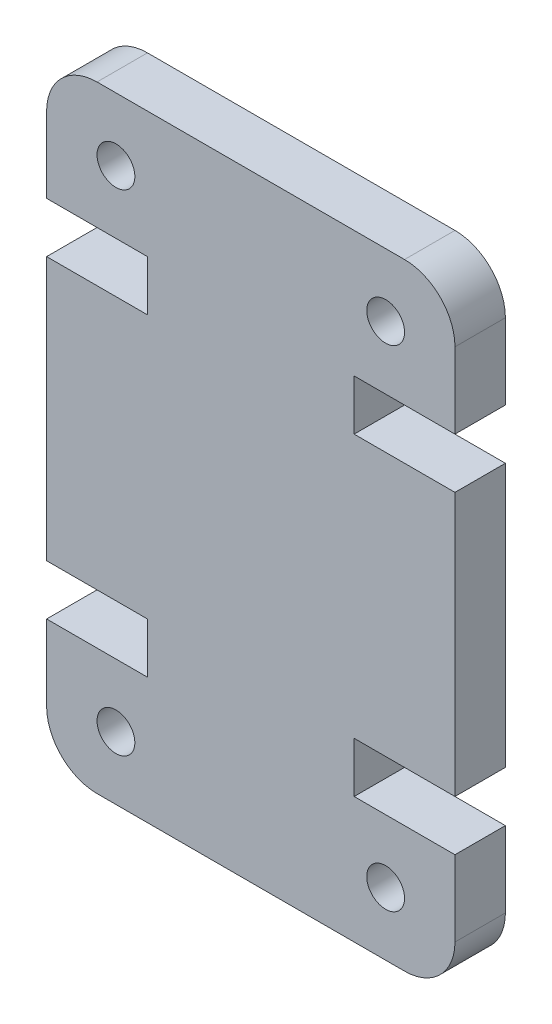
ISO-10303-21;
HEADER;
FILE_DESCRIPTION(('STEP AP214'),'2;1');
FILE_NAME('part.step','',(''),(''),'','','');
FILE_SCHEMA(('AUTOMOTIVE_DESIGN { 1 0 10303 214 1 1 1 1 }'));
ENDSEC;
DATA;
#1=APPLICATION_CONTEXT('core data for automotive mechanical design processes');
#2=APPLICATION_PROTOCOL_DEFINITION('international standard','automotive_design',2000,#1);
#3=PRODUCT_CONTEXT('',#1,'mechanical');
#4=PRODUCT('Part','Part','',(#3));
#5=PRODUCT_RELATED_PRODUCT_CATEGORY('part','',(#4));
#6=PRODUCT_DEFINITION_FORMATION('','',#4);
#7=PRODUCT_DEFINITION_CONTEXT('part definition',#1,'design');
#8=PRODUCT_DEFINITION('design','',#6,#7);
#9=PRODUCT_DEFINITION_SHAPE('','',#8);
#10=(LENGTH_UNIT() NAMED_UNIT(*) SI_UNIT(.MILLI.,.METRE.));
#11=(NAMED_UNIT(*) PLANE_ANGLE_UNIT() SI_UNIT($,.RADIAN.));
#12=(NAMED_UNIT(*) SI_UNIT($,.STERADIAN.) SOLID_ANGLE_UNIT());
#13=UNCERTAINTY_MEASURE_WITH_UNIT(LENGTH_MEASURE(1.E-05),#10,'distance_accuracy_value','');
#14=(GEOMETRIC_REPRESENTATION_CONTEXT(3) GLOBAL_UNCERTAINTY_ASSIGNED_CONTEXT((#13)) GLOBAL_UNIT_ASSIGNED_CONTEXT((#10,
#11,#12)) REPRESENTATION_CONTEXT('',''));
#15=CARTESIAN_POINT('',(0.,0.,0.));
#16=DIRECTION('',(0.,0.,1.));
#17=DIRECTION('',(1.,0.,0.));
#18=AXIS2_PLACEMENT_3D('',#15,#16,#17);
#19=CARTESIAN_POINT('',(14.2,2.,2.));
#20=DIRECTION('',(0.,0.,-1.));
#21=DIRECTION('',(-1.,0.,0.));
#22=AXIS2_PLACEMENT_3D('',#19,#20,#21);
#23=PLANE('',#22);
#24=CARTESIAN_POINT('',(2.74999999999805,21.9500000000001,2.));
#25=DIRECTION('',(0.,0.,1.));
#26=DIRECTION('',(-1.,0.,0.));
#27=AXIS2_PLACEMENT_3D('',#24,#25,#26);
#28=CIRCLE('',#27,0.750000000000028);
#29=CARTESIAN_POINT('',(1.99999999999802,21.9500000000001,2.));
#30=VERTEX_POINT('',#29);
#31=EDGE_CURVE('E448',#30,#30,#28,.T.);
#32=ORIENTED_EDGE('',*,*,#31,.F.);
#33=EDGE_LOOP('',(#32));
#34=FACE_BOUND('',#33,.T.);
#35=CARTESIAN_POINT('',(13.4500000000019,2.4999999999999,2.));
#36=DIRECTION('',(0.,0.,1.));
#37=DIRECTION('',(-1.,0.,0.));
#38=AXIS2_PLACEMENT_3D('',#35,#36,#37);
#39=CIRCLE('',#38,0.750000000000029);
#40=CARTESIAN_POINT('',(12.7000000000019,2.4999999999999,2.));
#41=VERTEX_POINT('',#40);
#42=EDGE_CURVE('E230',#41,#41,#39,.T.);
#43=ORIENTED_EDGE('',*,*,#42,.F.);
#44=EDGE_LOOP('',(#43));
#45=FACE_BOUND('',#44,.T.);
#46=CARTESIAN_POINT('',(14.2,2.,2.));
#47=DIRECTION('',(0.,0.,1.));
#48=DIRECTION('',(-1.,0.,0.));
#49=AXIS2_PLACEMENT_3D('',#46,#47,#48);
#50=CIRCLE('',#49,2.);
#51=CARTESIAN_POINT('',(14.2,0.,2.));
#52=VERTEX_POINT('',#51);
#53=CARTESIAN_POINT('',(16.2,2.,2.));
#54=VERTEX_POINT('',#53);
#55=EDGE_CURVE('E273',#52,#54,#50,.T.);
#56=ORIENTED_EDGE('',*,*,#55,.T.);
#57=DIRECTION('',(0.,1.,0.));
#58=VECTOR('',#57,1.);
#59=CARTESIAN_POINT('',(16.2,5.00000000000014,2.));
#60=LINE('',#59,#58);
#61=CARTESIAN_POINT('',(16.2,5.00000000000014,2.));
#62=VERTEX_POINT('',#61);
#63=EDGE_CURVE('E141',#54,#62,#60,.T.);
#64=ORIENTED_EDGE('',*,*,#63,.T.);
#65=DIRECTION('',(-1.,0.,0.));
#66=VECTOR('',#65,1.);
#67=CARTESIAN_POINT('',(12.2,5.00000000000014,2.));
#68=LINE('',#67,#66);
#69=CARTESIAN_POINT('',(12.2,5.00000000000014,2.));
#70=VERTEX_POINT('',#69);
#71=EDGE_CURVE('E336',#62,#70,#68,.T.);
#72=ORIENTED_EDGE('',*,*,#71,.T.);
#73=DIRECTION('',(0.,1.,0.));
#74=VECTOR('',#73,1.);
#75=CARTESIAN_POINT('',(12.2,7.00000000000014,2.));
#76=LINE('',#75,#74);
#77=CARTESIAN_POINT('',(12.2,7.00000000000014,2.));
#78=VERTEX_POINT('',#77);
#79=EDGE_CURVE('E355',#70,#78,#76,.T.);
#80=ORIENTED_EDGE('',*,*,#79,.T.);
#81=DIRECTION('',(1.,0.,0.));
#82=VECTOR('',#81,1.);
#83=CARTESIAN_POINT('',(16.2,7.00000000000014,2.));
#84=LINE('',#83,#82);
#85=CARTESIAN_POINT('',(16.2,7.00000000000014,2.));
#86=VERTEX_POINT('',#85);
#87=EDGE_CURVE('E352',#78,#86,#84,.T.);
#88=ORIENTED_EDGE('',*,*,#87,.T.);
#89=DIRECTION('',(0.,1.,0.));
#90=VECTOR('',#89,1.);
#91=CARTESIAN_POINT('',(16.2,17.4499999999999,2.));
#92=LINE('',#91,#90);
#93=CARTESIAN_POINT('',(16.2,17.4499999999999,2.));
#94=VERTEX_POINT('',#93);
#95=EDGE_CURVE('E354',#86,#94,#92,.T.);
#96=ORIENTED_EDGE('',*,*,#95,.T.);
#97=DIRECTION('',(-1.,0.,0.));
#98=VECTOR('',#97,1.);
#99=CARTESIAN_POINT('',(16.2,17.4499999999999,2.));
#100=LINE('',#99,#98);
#101=CARTESIAN_POINT('',(12.2,17.4499999999999,2.));
#102=VERTEX_POINT('',#101);
#103=EDGE_CURVE('E357',#94,#102,#100,.T.);
#104=ORIENTED_EDGE('',*,*,#103,.T.);
#105=DIRECTION('',(0.,1.,0.));
#106=VECTOR('',#105,1.);
#107=CARTESIAN_POINT('',(12.2,17.4499999999999,2.));
#108=LINE('',#107,#106);
#109=CARTESIAN_POINT('',(12.2,19.4499999999999,2.));
#110=VERTEX_POINT('',#109);
#111=EDGE_CURVE('E363',#102,#110,#108,.T.);
#112=ORIENTED_EDGE('',*,*,#111,.T.);
#113=DIRECTION('',(1.,0.,0.));
#114=VECTOR('',#113,1.);
#115=CARTESIAN_POINT('',(12.2,19.4499999999999,2.));
#116=LINE('',#115,#114);
#117=CARTESIAN_POINT('',(16.2,19.4499999999999,2.));
#118=VERTEX_POINT('',#117);
#119=EDGE_CURVE('E365',#110,#118,#116,.T.);
#120=ORIENTED_EDGE('',*,*,#119,.T.);
#121=DIRECTION('',(0.,1.,0.));
#122=VECTOR('',#121,1.);
#123=CARTESIAN_POINT('',(16.2,19.4499999999999,2.));
#124=LINE('',#123,#122);
#125=CARTESIAN_POINT('',(16.2,22.45,2.));
#126=VERTEX_POINT('',#125);
#127=EDGE_CURVE('E367',#118,#126,#124,.T.);
#128=ORIENTED_EDGE('',*,*,#127,.T.);
#129=CARTESIAN_POINT('',(14.2,22.45,2.));
#130=DIRECTION('',(0.,0.,1.));
#131=DIRECTION('',(1.,0.,0.));
#132=AXIS2_PLACEMENT_3D('',#129,#130,#131);
#133=CIRCLE('',#132,2.);
#134=CARTESIAN_POINT('',(14.2,24.45,2.));
#135=VERTEX_POINT('',#134);
#136=EDGE_CURVE('E369',#126,#135,#133,.T.);
#137=ORIENTED_EDGE('',*,*,#136,.T.);
#138=DIRECTION('',(-1.,0.,0.));
#139=VECTOR('',#138,1.);
#140=CARTESIAN_POINT('',(1.99999999999999,24.45,2.));
#141=LINE('',#140,#139);
#142=CARTESIAN_POINT('',(1.99999999999999,24.45,2.));
#143=VERTEX_POINT('',#142);
#144=EDGE_CURVE('E371',#135,#143,#141,.T.);
#145=ORIENTED_EDGE('',*,*,#144,.T.);
#146=CARTESIAN_POINT('',(2.,22.45,2.));
#147=DIRECTION('',(0.,0.,1.));
#148=DIRECTION('',(-1.,0.,0.));
#149=AXIS2_PLACEMENT_3D('',#146,#147,#148);
#150=CIRCLE('',#149,2.);
#151=CARTESIAN_POINT('',(0.,22.45,2.));
#152=VERTEX_POINT('',#151);
#153=EDGE_CURVE('E373',#143,#152,#150,.T.);
#154=ORIENTED_EDGE('',*,*,#153,.T.);
#155=DIRECTION('',(0.,-1.,0.));
#156=VECTOR('',#155,1.);
#157=CARTESIAN_POINT('',(0.,19.4499999999999,2.));
#158=LINE('',#157,#156);
#159=CARTESIAN_POINT('',(0.,19.4499999999999,2.));
#160=VERTEX_POINT('',#159);
#161=EDGE_CURVE('E375',#152,#160,#158,.T.);
#162=ORIENTED_EDGE('',*,*,#161,.T.);
#163=DIRECTION('',(1.,0.,0.));
#164=VECTOR('',#163,1.);
#165=CARTESIAN_POINT('',(3.99999999999999,19.4499999999999,2.));
#166=LINE('',#165,#164);
#167=CARTESIAN_POINT('',(3.99999999999999,19.4499999999999,2.));
#168=VERTEX_POINT('',#167);
#169=EDGE_CURVE('E377',#160,#168,#166,.T.);
#170=ORIENTED_EDGE('',*,*,#169,.T.);
#171=DIRECTION('',(0.,-1.,0.));
#172=VECTOR('',#171,1.);
#173=CARTESIAN_POINT('',(3.99999999999999,17.4499999999999,2.));
#174=LINE('',#173,#172);
#175=CARTESIAN_POINT('',(3.99999999999999,17.4499999999999,2.));
#176=VERTEX_POINT('',#175);
#177=EDGE_CURVE('E379',#168,#176,#174,.T.);
#178=ORIENTED_EDGE('',*,*,#177,.T.);
#179=DIRECTION('',(-1.,0.,0.));
#180=VECTOR('',#179,1.);
#181=CARTESIAN_POINT('',(0.,17.4499999999999,2.));
#182=LINE('',#181,#180);
#183=CARTESIAN_POINT('',(0.,17.4499999999999,2.));
#184=VERTEX_POINT('',#183);
#185=EDGE_CURVE('E381',#176,#184,#182,.T.);
#186=ORIENTED_EDGE('',*,*,#185,.T.);
#187=DIRECTION('',(0.,-1.,0.));
#188=VECTOR('',#187,1.);
#189=CARTESIAN_POINT('',(0.,17.4499999999999,2.));
#190=LINE('',#189,#188);
#191=CARTESIAN_POINT('',(0.,7.00000000000012,2.));
#192=VERTEX_POINT('',#191);
#193=EDGE_CURVE('E383',#184,#192,#190,.T.);
#194=ORIENTED_EDGE('',*,*,#193,.T.);
#195=DIRECTION('',(1.,0.,0.));
#196=VECTOR('',#195,1.);
#197=CARTESIAN_POINT('',(0.,7.00000000000012,2.));
#198=LINE('',#197,#196);
#199=CARTESIAN_POINT('',(4.,7.00000000000014,2.));
#200=VERTEX_POINT('',#199);
#201=EDGE_CURVE('E385',#192,#200,#198,.T.);
#202=ORIENTED_EDGE('',*,*,#201,.T.);
#203=DIRECTION('',(0.,-1.,0.));
#204=VECTOR('',#203,1.);
#205=CARTESIAN_POINT('',(4.,7.00000000000014,2.));
#206=LINE('',#205,#204);
#207=CARTESIAN_POINT('',(4.,5.00000000000014,2.));
#208=VERTEX_POINT('',#207);
#209=EDGE_CURVE('E387',#200,#208,#206,.T.);
#210=ORIENTED_EDGE('',*,*,#209,.T.);
#211=DIRECTION('',(-1.,0.,0.));
#212=VECTOR('',#211,1.);
#213=CARTESIAN_POINT('',(4.,5.00000000000014,2.));
#214=LINE('',#213,#212);
#215=CARTESIAN_POINT('',(0.,5.00000000000014,2.));
#216=VERTEX_POINT('',#215);
#217=EDGE_CURVE('E208',#208,#216,#214,.T.);
#218=ORIENTED_EDGE('',*,*,#217,.T.);
#219=DIRECTION('',(0.,-1.,0.));
#220=VECTOR('',#219,1.);
#221=CARTESIAN_POINT('',(0.,5.00000000000014,2.));
#222=LINE('',#221,#220);
#223=CARTESIAN_POINT('',(0.,2.00000000000002,2.));
#224=VERTEX_POINT('',#223);
#225=EDGE_CURVE('E202',#216,#224,#222,.T.);
#226=ORIENTED_EDGE('',*,*,#225,.T.);
#227=CARTESIAN_POINT('',(2.,2.,2.));
#228=DIRECTION('',(0.,0.,1.));
#229=DIRECTION('',(1.,0.,0.));
#230=AXIS2_PLACEMENT_3D('',#227,#228,#229);
#231=CIRCLE('',#230,2.);
#232=CARTESIAN_POINT('',(2.,0.,2.));
#233=VERTEX_POINT('',#232);
#234=EDGE_CURVE('E206',#224,#233,#231,.T.);
#235=ORIENTED_EDGE('',*,*,#234,.T.);
#236=DIRECTION('',(1.,0.,0.));
#237=VECTOR('',#236,1.);
#238=CARTESIAN_POINT('',(2.,0.,2.));
#239=LINE('',#238,#237);
#240=EDGE_CURVE('E50',#233,#52,#239,.T.);
#241=ORIENTED_EDGE('',*,*,#240,.T.);
#242=EDGE_LOOP('',(#56,#64,#72,#80,#88,#96,#104,#112,#120,#128,#137,#145,#154,#162,#170,#178,
#186,#194,#202,#210,#218,#226,#235,#241));
#243=FACE_BOUND('',#242,.T.);
#244=CARTESIAN_POINT('',(2.74999999999805,2.4999999999999,2.));
#245=DIRECTION('',(0.,0.,1.));
#246=DIRECTION('',(1.,0.,0.));
#247=AXIS2_PLACEMENT_3D('',#244,#245,#246);
#248=CIRCLE('',#247,0.750000000000028);
#249=CARTESIAN_POINT('',(3.49999999999808,2.4999999999999,2.));
#250=VERTEX_POINT('',#249);
#251=EDGE_CURVE('E454',#250,#250,#248,.T.);
#252=ORIENTED_EDGE('',*,*,#251,.F.);
#253=EDGE_LOOP('',(#252));
#254=FACE_BOUND('',#253,.T.);
#255=CARTESIAN_POINT('',(13.4500000000019,21.9500000000001,2.));
#256=DIRECTION('',(0.,0.,1.));
#257=DIRECTION('',(1.,0.,0.));
#258=AXIS2_PLACEMENT_3D('',#255,#256,#257);
#259=CIRCLE('',#258,0.750000000000026);
#260=CARTESIAN_POINT('',(14.200000000002,21.9500000000001,2.));
#261=VERTEX_POINT('',#260);
#262=EDGE_CURVE('E439',#261,#261,#259,.T.);
#263=ORIENTED_EDGE('',*,*,#262,.F.);
#264=EDGE_LOOP('',(#263));
#265=FACE_BOUND('',#264,.T.);
#266=ADVANCED_FACE('F33',(#34,#45,#243,#254,#265),#23,.F.);
#267=CARTESIAN_POINT('',(14.2,2.,0.));
#268=DIRECTION('',(0.,0.,-1.));
#269=DIRECTION('',(-1.,0.,0.));
#270=AXIS2_PLACEMENT_3D('',#267,#268,#269);
#271=PLANE('',#270);
#272=CARTESIAN_POINT('',(2.74999999999805,21.9500000000001,0.));
#273=DIRECTION('',(0.,0.,1.));
#274=DIRECTION('',(-1.,0.,0.));
#275=AXIS2_PLACEMENT_3D('',#272,#273,#274);
#276=CIRCLE('',#275,0.750000000000028);
#277=CARTESIAN_POINT('',(1.99999999999802,21.9500000000001,0.));
#278=VERTEX_POINT('',#277);
#279=EDGE_CURVE('E445',#278,#278,#276,.T.);
#280=ORIENTED_EDGE('',*,*,#279,.T.);
#281=EDGE_LOOP('',(#280));
#282=FACE_BOUND('',#281,.T.);
#283=CARTESIAN_POINT('',(13.4500000000019,2.4999999999999,0.));
#284=DIRECTION('',(0.,0.,1.));
#285=DIRECTION('',(-1.,0.,0.));
#286=AXIS2_PLACEMENT_3D('',#283,#284,#285);
#287=CIRCLE('',#286,0.750000000000029);
#288=CARTESIAN_POINT('',(12.7000000000019,2.4999999999999,0.));
#289=VERTEX_POINT('',#288);
#290=EDGE_CURVE('E457',#289,#289,#287,.T.);
#291=ORIENTED_EDGE('',*,*,#290,.T.);
#292=EDGE_LOOP('',(#291));
#293=FACE_BOUND('',#292,.T.);
#294=CARTESIAN_POINT('',(14.2,2.,0.));
#295=DIRECTION('',(0.,0.,1.));
#296=DIRECTION('',(-1.,0.,0.));
#297=AXIS2_PLACEMENT_3D('',#294,#295,#296);
#298=CIRCLE('',#297,2.);
#299=CARTESIAN_POINT('',(14.2,0.,0.));
#300=VERTEX_POINT('',#299);
#301=CARTESIAN_POINT('',(16.2,2.,0.));
#302=VERTEX_POINT('',#301);
#303=EDGE_CURVE('E226',#300,#302,#298,.T.);
#304=ORIENTED_EDGE('',*,*,#303,.F.);
#305=DIRECTION('',(1.,0.,0.));
#306=VECTOR('',#305,1.);
#307=CARTESIAN_POINT('',(2.,0.,0.));
#308=LINE('',#307,#306);
#309=CARTESIAN_POINT('',(2.,0.,0.));
#310=VERTEX_POINT('',#309);
#311=EDGE_CURVE('E133',#310,#300,#308,.T.);
#312=ORIENTED_EDGE('',*,*,#311,.F.);
#313=CARTESIAN_POINT('',(2.,2.,0.));
#314=DIRECTION('',(0.,0.,1.));
#315=DIRECTION('',(1.,0.,0.));
#316=AXIS2_PLACEMENT_3D('',#313,#314,#315);
#317=CIRCLE('',#316,2.);
#318=CARTESIAN_POINT('',(0.,2.00000000000002,0.));
#319=VERTEX_POINT('',#318);
#320=EDGE_CURVE('E127',#319,#310,#317,.T.);
#321=ORIENTED_EDGE('',*,*,#320,.F.);
#322=DIRECTION('',(0.,-1.,0.));
#323=VECTOR('',#322,1.);
#324=CARTESIAN_POINT('',(0.,5.00000000000014,0.));
#325=LINE('',#324,#323);
#326=CARTESIAN_POINT('',(0.,5.00000000000014,0.));
#327=VERTEX_POINT('',#326);
#328=EDGE_CURVE('E216',#327,#319,#325,.T.);
#329=ORIENTED_EDGE('',*,*,#328,.F.);
#330=DIRECTION('',(-1.,0.,0.));
#331=VECTOR('',#330,1.);
#332=CARTESIAN_POINT('',(4.,5.00000000000014,0.));
#333=LINE('',#332,#331);
#334=CARTESIAN_POINT('',(4.,5.00000000000014,0.));
#335=VERTEX_POINT('',#334);
#336=EDGE_CURVE('E268',#335,#327,#333,.T.);
#337=ORIENTED_EDGE('',*,*,#336,.F.);
#338=DIRECTION('',(0.,-1.,0.));
#339=VECTOR('',#338,1.);
#340=CARTESIAN_POINT('',(4.,7.00000000000014,0.));
#341=LINE('',#340,#339);
#342=CARTESIAN_POINT('',(4.,7.00000000000014,0.));
#343=VERTEX_POINT('',#342);
#344=EDGE_CURVE('E266',#343,#335,#341,.T.);
#345=ORIENTED_EDGE('',*,*,#344,.F.);
#346=DIRECTION('',(1.,0.,0.));
#347=VECTOR('',#346,1.);
#348=CARTESIAN_POINT('',(0.,7.00000000000012,0.));
#349=LINE('',#348,#347);
#350=CARTESIAN_POINT('',(0.,7.00000000000012,0.));
#351=VERTEX_POINT('',#350);
#352=EDGE_CURVE('E264',#351,#343,#349,.T.);
#353=ORIENTED_EDGE('',*,*,#352,.F.);
#354=DIRECTION('',(0.,-1.,0.));
#355=VECTOR('',#354,1.);
#356=CARTESIAN_POINT('',(0.,17.4499999999999,0.));
#357=LINE('',#356,#355);
#358=CARTESIAN_POINT('',(0.,17.4499999999999,0.));
#359=VERTEX_POINT('',#358);
#360=EDGE_CURVE('E262',#359,#351,#357,.T.);
#361=ORIENTED_EDGE('',*,*,#360,.F.);
#362=DIRECTION('',(-1.,0.,0.));
#363=VECTOR('',#362,1.);
#364=CARTESIAN_POINT('',(0.,17.4499999999999,0.));
#365=LINE('',#364,#363);
#366=CARTESIAN_POINT('',(3.99999999999999,17.4499999999999,0.));
#367=VERTEX_POINT('',#366);
#368=EDGE_CURVE('E260',#367,#359,#365,.T.);
#369=ORIENTED_EDGE('',*,*,#368,.F.);
#370=DIRECTION('',(0.,-1.,0.));
#371=VECTOR('',#370,1.);
#372=CARTESIAN_POINT('',(3.99999999999999,17.4499999999999,0.));
#373=LINE('',#372,#371);
#374=CARTESIAN_POINT('',(3.99999999999999,19.4499999999999,0.));
#375=VERTEX_POINT('',#374);
#376=EDGE_CURVE('E258',#375,#367,#373,.T.);
#377=ORIENTED_EDGE('',*,*,#376,.F.);
#378=DIRECTION('',(1.,0.,0.));
#379=VECTOR('',#378,1.);
#380=CARTESIAN_POINT('',(3.99999999999999,19.4499999999999,0.));
#381=LINE('',#380,#379);
#382=CARTESIAN_POINT('',(0.,19.4499999999999,0.));
#383=VERTEX_POINT('',#382);
#384=EDGE_CURVE('E256',#383,#375,#381,.T.);
#385=ORIENTED_EDGE('',*,*,#384,.F.);
#386=DIRECTION('',(0.,-1.,0.));
#387=VECTOR('',#386,1.);
#388=CARTESIAN_POINT('',(0.,19.4499999999999,0.));
#389=LINE('',#388,#387);
#390=CARTESIAN_POINT('',(0.,22.45,0.));
#391=VERTEX_POINT('',#390);
#392=EDGE_CURVE('E254',#391,#383,#389,.T.);
#393=ORIENTED_EDGE('',*,*,#392,.F.);
#394=CARTESIAN_POINT('',(2.,22.45,0.));
#395=DIRECTION('',(0.,0.,1.));
#396=DIRECTION('',(-1.,0.,0.));
#397=AXIS2_PLACEMENT_3D('',#394,#395,#396);
#398=CIRCLE('',#397,2.);
#399=CARTESIAN_POINT('',(1.99999999999999,24.45,0.));
#400=VERTEX_POINT('',#399);
#401=EDGE_CURVE('E252',#400,#391,#398,.T.);
#402=ORIENTED_EDGE('',*,*,#401,.F.);
#403=DIRECTION('',(-1.,0.,0.));
#404=VECTOR('',#403,1.);
#405=CARTESIAN_POINT('',(1.99999999999999,24.45,0.));
#406=LINE('',#405,#404);
#407=CARTESIAN_POINT('',(14.2,24.45,0.));
#408=VERTEX_POINT('',#407);
#409=EDGE_CURVE('E250',#408,#400,#406,.T.);
#410=ORIENTED_EDGE('',*,*,#409,.F.);
#411=CARTESIAN_POINT('',(14.2,22.45,0.));
#412=DIRECTION('',(0.,0.,1.));
#413=DIRECTION('',(1.,0.,0.));
#414=AXIS2_PLACEMENT_3D('',#411,#412,#413);
#415=CIRCLE('',#414,2.);
#416=CARTESIAN_POINT('',(16.2,22.45,0.));
#417=VERTEX_POINT('',#416);
#418=EDGE_CURVE('E248',#417,#408,#415,.T.);
#419=ORIENTED_EDGE('',*,*,#418,.F.);
#420=DIRECTION('',(0.,1.,0.));
#421=VECTOR('',#420,1.);
#422=CARTESIAN_POINT('',(16.2,19.4499999999999,0.));
#423=LINE('',#422,#421);
#424=CARTESIAN_POINT('',(16.2,19.4499999999999,0.));
#425=VERTEX_POINT('',#424);
#426=EDGE_CURVE('E246',#425,#417,#423,.T.);
#427=ORIENTED_EDGE('',*,*,#426,.F.);
#428=DIRECTION('',(1.,0.,0.));
#429=VECTOR('',#428,1.);
#430=CARTESIAN_POINT('',(12.2,19.4499999999999,0.));
#431=LINE('',#430,#429);
#432=CARTESIAN_POINT('',(12.2,19.4499999999999,0.));
#433=VERTEX_POINT('',#432);
#434=EDGE_CURVE('E244',#433,#425,#431,.T.);
#435=ORIENTED_EDGE('',*,*,#434,.F.);
#436=DIRECTION('',(0.,1.,0.));
#437=VECTOR('',#436,1.);
#438=CARTESIAN_POINT('',(12.2,17.4499999999999,0.));
#439=LINE('',#438,#437);
#440=CARTESIAN_POINT('',(12.2,17.4499999999999,0.));
#441=VERTEX_POINT('',#440);
#442=EDGE_CURVE('E242',#441,#433,#439,.T.);
#443=ORIENTED_EDGE('',*,*,#442,.F.);
#444=DIRECTION('',(-1.,0.,0.));
#445=VECTOR('',#444,1.);
#446=CARTESIAN_POINT('',(16.2,17.4499999999999,0.));
#447=LINE('',#446,#445);
#448=CARTESIAN_POINT('',(16.2,17.4499999999999,0.));
#449=VERTEX_POINT('',#448);
#450=EDGE_CURVE('E240',#449,#441,#447,.T.);
#451=ORIENTED_EDGE('',*,*,#450,.F.);
#452=DIRECTION('',(0.,1.,0.));
#453=VECTOR('',#452,1.);
#454=CARTESIAN_POINT('',(16.2,17.4499999999999,0.));
#455=LINE('',#454,#453);
#456=CARTESIAN_POINT('',(16.2,7.00000000000014,0.));
#457=VERTEX_POINT('',#456);
#458=EDGE_CURVE('E238',#457,#449,#455,.T.);
#459=ORIENTED_EDGE('',*,*,#458,.F.);
#460=DIRECTION('',(1.,0.,0.));
#461=VECTOR('',#460,1.);
#462=CARTESIAN_POINT('',(16.2,7.00000000000014,0.));
#463=LINE('',#462,#461);
#464=CARTESIAN_POINT('',(12.2,7.00000000000014,0.));
#465=VERTEX_POINT('',#464);
#466=EDGE_CURVE('E236',#465,#457,#463,.T.);
#467=ORIENTED_EDGE('',*,*,#466,.F.);
#468=DIRECTION('',(0.,1.,0.));
#469=VECTOR('',#468,1.);
#470=CARTESIAN_POINT('',(12.2,7.00000000000014,0.));
#471=LINE('',#470,#469);
#472=CARTESIAN_POINT('',(12.2,5.00000000000014,0.));
#473=VERTEX_POINT('',#472);
#474=EDGE_CURVE('E234',#473,#465,#471,.T.);
#475=ORIENTED_EDGE('',*,*,#474,.F.);
#476=DIRECTION('',(-1.,0.,0.));
#477=VECTOR('',#476,1.);
#478=CARTESIAN_POINT('',(12.2,5.00000000000014,0.));
#479=LINE('',#478,#477);
#480=CARTESIAN_POINT('',(16.2,5.00000000000014,0.));
#481=VERTEX_POINT('',#480);
#482=EDGE_CURVE('E232',#481,#473,#479,.T.);
#483=ORIENTED_EDGE('',*,*,#482,.F.);
#484=DIRECTION('',(0.,1.,0.));
#485=VECTOR('',#484,1.);
#486=CARTESIAN_POINT('',(16.2,5.00000000000014,0.));
#487=LINE('',#486,#485);
#488=EDGE_CURVE('E229',#302,#481,#487,.T.);
#489=ORIENTED_EDGE('',*,*,#488,.F.);
#490=EDGE_LOOP('',(#304,#312,#321,#329,#337,#345,#353,#361,#369,#377,#385,#393,#402,#410,#419,
#427,#435,#443,#451,#459,#467,#475,#483,#489));
#491=FACE_BOUND('',#490,.T.);
#492=CARTESIAN_POINT('',(2.74999999999805,2.4999999999999,0.));
#493=DIRECTION('',(0.,0.,1.));
#494=DIRECTION('',(1.,0.,0.));
#495=AXIS2_PLACEMENT_3D('',#492,#493,#494);
#496=CIRCLE('',#495,0.750000000000028);
#497=CARTESIAN_POINT('',(3.49999999999808,2.4999999999999,0.));
#498=VERTEX_POINT('',#497);
#499=EDGE_CURVE('E451',#498,#498,#496,.T.);
#500=ORIENTED_EDGE('',*,*,#499,.T.);
#501=EDGE_LOOP('',(#500));
#502=FACE_BOUND('',#501,.T.);
#503=CARTESIAN_POINT('',(13.4500000000019,21.9500000000001,0.));
#504=DIRECTION('',(0.,0.,1.));
#505=DIRECTION('',(1.,0.,0.));
#506=AXIS2_PLACEMENT_3D('',#503,#504,#505);
#507=CIRCLE('',#506,0.750000000000026);
#508=CARTESIAN_POINT('',(14.200000000002,21.9500000000001,0.));
#509=VERTEX_POINT('',#508);
#510=EDGE_CURVE('E442',#509,#509,#507,.T.);
#511=ORIENTED_EDGE('',*,*,#510,.T.);
#512=EDGE_LOOP('',(#511));
#513=FACE_BOUND('',#512,.T.);
#514=ADVANCED_FACE('F340',(#282,#293,#491,#502,#513),#271,.T.);
#515=CARTESIAN_POINT('',(14.2,2.,2.));
#516=DIRECTION('',(0.,0.,-1.));
#517=DIRECTION('',(-1.,0.,0.));
#518=AXIS2_PLACEMENT_3D('',#515,#516,#517);
#519=CYLINDRICAL_SURFACE('',#518,2.);
#520=ORIENTED_EDGE('',*,*,#303,.T.);
#521=DIRECTION('',(0.,0.,-1.));
#522=VECTOR('',#521,1.);
#523=CARTESIAN_POINT('',(16.2,2.,2.));
#524=LINE('',#523,#522);
#525=EDGE_CURVE('E11',#54,#302,#524,.T.);
#526=ORIENTED_EDGE('',*,*,#525,.F.);
#527=ORIENTED_EDGE('',*,*,#55,.F.);
#528=DIRECTION('',(0.,0.,-1.));
#529=VECTOR('',#528,1.);
#530=CARTESIAN_POINT('',(14.2,0.,2.));
#531=LINE('',#530,#529);
#532=EDGE_CURVE('E222',#52,#300,#531,.T.);
#533=ORIENTED_EDGE('',*,*,#532,.T.);
#534=EDGE_LOOP('',(#520,#526,#527,#533));
#535=FACE_BOUND('',#534,.T.);
#536=ADVANCED_FACE('F35',(#535),#519,.T.);
#537=CARTESIAN_POINT('',(16.2,5.00000000000014,2.));
#538=DIRECTION('',(-1.,0.,0.));
#539=DIRECTION('',(0.,-1.,0.));
#540=AXIS2_PLACEMENT_3D('',#537,#538,#539);
#541=PLANE('',#540);
#542=ORIENTED_EDGE('',*,*,#488,.T.);
#543=DIRECTION('',(0.,0.,-1.));
#544=VECTOR('',#543,1.);
#545=CARTESIAN_POINT('',(16.2,5.00000000000014,2.));
#546=LINE('',#545,#544);
#547=EDGE_CURVE('E42',#62,#481,#546,.T.);
#548=ORIENTED_EDGE('',*,*,#547,.F.);
#549=ORIENTED_EDGE('',*,*,#63,.F.);
#550=ORIENTED_EDGE('',*,*,#525,.T.);
#551=EDGE_LOOP('',(#542,#548,#549,#550));
#552=FACE_BOUND('',#551,.T.);
#553=ADVANCED_FACE('F686',(#552),#541,.F.);
#554=CARTESIAN_POINT('',(12.2,5.00000000000014,2.));
#555=DIRECTION('',(0.,-1.,0.));
#556=DIRECTION('',(0.,0.,-1.));
#557=AXIS2_PLACEMENT_3D('',#554,#555,#556);
#558=PLANE('',#557);
#559=ORIENTED_EDGE('',*,*,#482,.T.);
#560=DIRECTION('',(0.,0.,-1.));
#561=VECTOR('',#560,1.);
#562=CARTESIAN_POINT('',(12.2,5.00000000000014,2.));
#563=LINE('',#562,#561);
#564=EDGE_CURVE('E328',#70,#473,#563,.T.);
#565=ORIENTED_EDGE('',*,*,#564,.F.);
#566=ORIENTED_EDGE('',*,*,#71,.F.);
#567=ORIENTED_EDGE('',*,*,#547,.T.);
#568=EDGE_LOOP('',(#559,#565,#566,#567));
#569=FACE_BOUND('',#568,.T.);
#570=ADVANCED_FACE('F334',(#569),#558,.F.);
#571=CARTESIAN_POINT('',(12.2,7.00000000000014,2.));
#572=DIRECTION('',(-1.,0.,0.));
#573=DIRECTION('',(0.,0.,1.));
#574=AXIS2_PLACEMENT_3D('',#571,#572,#573);
#575=PLANE('',#574);
#576=ORIENTED_EDGE('',*,*,#474,.T.);
#577=DIRECTION('',(0.,0.,-1.));
#578=VECTOR('',#577,1.);
#579=CARTESIAN_POINT('',(12.2,7.00000000000014,2.));
#580=LINE('',#579,#578);
#581=EDGE_CURVE('E325',#78,#465,#580,.T.);
#582=ORIENTED_EDGE('',*,*,#581,.F.);
#583=ORIENTED_EDGE('',*,*,#79,.F.);
#584=ORIENTED_EDGE('',*,*,#564,.T.);
#585=EDGE_LOOP('',(#576,#582,#583,#584));
#586=FACE_BOUND('',#585,.T.);
#587=ADVANCED_FACE('F346',(#586),#575,.F.);
#588=CARTESIAN_POINT('',(16.2,7.00000000000014,2.));
#589=DIRECTION('',(0.,1.,0.));
#590=DIRECTION('',(-1.,0.,0.));
#591=AXIS2_PLACEMENT_3D('',#588,#589,#590);
#592=PLANE('',#591);
#593=ORIENTED_EDGE('',*,*,#466,.T.);
#594=DIRECTION('',(0.,0.,-1.));
#595=VECTOR('',#594,1.);
#596=CARTESIAN_POINT('',(16.2,7.00000000000014,2.));
#597=LINE('',#596,#595);
#598=EDGE_CURVE('E322',#86,#457,#597,.T.);
#599=ORIENTED_EDGE('',*,*,#598,.F.);
#600=ORIENTED_EDGE('',*,*,#87,.F.);
#601=ORIENTED_EDGE('',*,*,#581,.T.);
#602=EDGE_LOOP('',(#593,#599,#600,#601));
#603=FACE_BOUND('',#602,.T.);
#604=ADVANCED_FACE('F350',(#603),#592,.F.);
#605=CARTESIAN_POINT('',(16.2,17.4499999999999,2.));
#606=DIRECTION('',(-1.,0.,0.));
#607=DIRECTION('',(0.,0.,1.));
#608=AXIS2_PLACEMENT_3D('',#605,#606,#607);
#609=PLANE('',#608);
#610=ORIENTED_EDGE('',*,*,#458,.T.);
#611=DIRECTION('',(0.,0.,-1.));
#612=VECTOR('',#611,1.);
#613=CARTESIAN_POINT('',(16.2,17.4499999999999,2.));
#614=LINE('',#613,#612);
#615=EDGE_CURVE('E319',#94,#449,#614,.T.);
#616=ORIENTED_EDGE('',*,*,#615,.F.);
#617=ORIENTED_EDGE('',*,*,#95,.F.);
#618=ORIENTED_EDGE('',*,*,#598,.T.);
#619=EDGE_LOOP('',(#610,#616,#617,#618));
#620=FACE_BOUND('',#619,.T.);
#621=ADVANCED_FACE('F651',(#620),#609,.F.);
#622=CARTESIAN_POINT('',(16.2,17.4499999999999,2.));
#623=DIRECTION('',(0.,-1.,0.));
#624=DIRECTION('',(1.,0.,0.));
#625=AXIS2_PLACEMENT_3D('',#622,#623,#624);
#626=PLANE('',#625);
#627=ORIENTED_EDGE('',*,*,#450,.T.);
#628=DIRECTION('',(0.,0.,-1.));
#629=VECTOR('',#628,1.);
#630=CARTESIAN_POINT('',(12.2,17.4499999999999,2.));
#631=LINE('',#630,#629);
#632=EDGE_CURVE('E316',#102,#441,#631,.T.);
#633=ORIENTED_EDGE('',*,*,#632,.F.);
#634=ORIENTED_EDGE('',*,*,#103,.F.);
#635=ORIENTED_EDGE('',*,*,#615,.T.);
#636=EDGE_LOOP('',(#627,#633,#634,#635));
#637=FACE_BOUND('',#636,.T.);
#638=ADVANCED_FACE('F641',(#637),#626,.F.);
#639=CARTESIAN_POINT('',(12.2,17.4499999999999,2.));
#640=DIRECTION('',(-1.,0.,0.));
#641=DIRECTION('',(0.,0.,1.));
#642=AXIS2_PLACEMENT_3D('',#639,#640,#641);
#643=PLANE('',#642);
#644=ORIENTED_EDGE('',*,*,#442,.T.);
#645=DIRECTION('',(0.,0.,-1.));
#646=VECTOR('',#645,1.);
#647=CARTESIAN_POINT('',(12.2,19.4499999999999,2.));
#648=LINE('',#647,#646);
#649=EDGE_CURVE('E313',#110,#433,#648,.T.);
#650=ORIENTED_EDGE('',*,*,#649,.F.);
#651=ORIENTED_EDGE('',*,*,#111,.F.);
#652=ORIENTED_EDGE('',*,*,#632,.T.);
#653=EDGE_LOOP('',(#644,#650,#651,#652));
#654=FACE_BOUND('',#653,.T.);
#655=ADVANCED_FACE('F631',(#654),#643,.F.);
#656=CARTESIAN_POINT('',(12.2,19.4499999999999,2.));
#657=DIRECTION('',(0.,1.,0.));
#658=DIRECTION('',(0.,0.,1.));
#659=AXIS2_PLACEMENT_3D('',#656,#657,#658);
#660=PLANE('',#659);
#661=ORIENTED_EDGE('',*,*,#434,.T.);
#662=DIRECTION('',(0.,0.,-1.));
#663=VECTOR('',#662,1.);
#664=CARTESIAN_POINT('',(16.2,19.4499999999999,2.));
#665=LINE('',#664,#663);
#666=EDGE_CURVE('E310',#118,#425,#665,.T.);
#667=ORIENTED_EDGE('',*,*,#666,.F.);
#668=ORIENTED_EDGE('',*,*,#119,.F.);
#669=ORIENTED_EDGE('',*,*,#649,.T.);
#670=EDGE_LOOP('',(#661,#667,#668,#669));
#671=FACE_BOUND('',#670,.T.);
#672=ADVANCED_FACE('F621',(#671),#660,.F.);
#673=CARTESIAN_POINT('',(16.2,19.4499999999999,2.));
#674=DIRECTION('',(-1.,0.,0.));
#675=DIRECTION('',(0.,-1.,0.));
#676=AXIS2_PLACEMENT_3D('',#673,#674,#675);
#677=PLANE('',#676);
#678=ORIENTED_EDGE('',*,*,#426,.T.);
#679=DIRECTION('',(0.,0.,-1.));
#680=VECTOR('',#679,1.);
#681=CARTESIAN_POINT('',(16.2,22.45,2.));
#682=LINE('',#681,#680);
#683=EDGE_CURVE('E307',#126,#417,#682,.T.);
#684=ORIENTED_EDGE('',*,*,#683,.F.);
#685=ORIENTED_EDGE('',*,*,#127,.F.);
#686=ORIENTED_EDGE('',*,*,#666,.T.);
#687=EDGE_LOOP('',(#678,#684,#685,#686));
#688=FACE_BOUND('',#687,.T.);
#689=ADVANCED_FACE('F611',(#688),#677,.F.);
#690=CARTESIAN_POINT('',(14.2,22.45,2.));
#691=DIRECTION('',(0.,0.,-1.));
#692=DIRECTION('',(-1.,0.,0.));
#693=AXIS2_PLACEMENT_3D('',#690,#691,#692);
#694=CYLINDRICAL_SURFACE('',#693,2.);
#695=ORIENTED_EDGE('',*,*,#418,.T.);
#696=DIRECTION('',(0.,0.,-1.));
#697=VECTOR('',#696,1.);
#698=CARTESIAN_POINT('',(14.2,24.45,2.));
#699=LINE('',#698,#697);
#700=EDGE_CURVE('E304',#135,#408,#699,.T.);
#701=ORIENTED_EDGE('',*,*,#700,.F.);
#702=ORIENTED_EDGE('',*,*,#136,.F.);
#703=ORIENTED_EDGE('',*,*,#683,.T.);
#704=EDGE_LOOP('',(#695,#701,#702,#703));
#705=FACE_BOUND('',#704,.T.);
#706=ADVANCED_FACE('F601',(#705),#694,.T.);
#707=CARTESIAN_POINT('',(1.99999999999999,24.45,2.));
#708=DIRECTION('',(0.,-1.,0.));
#709=DIRECTION('',(0.,0.,-1.));
#710=AXIS2_PLACEMENT_3D('',#707,#708,#709);
#711=PLANE('',#710);
#712=ORIENTED_EDGE('',*,*,#409,.T.);
#713=DIRECTION('',(0.,0.,-1.));
#714=VECTOR('',#713,1.);
#715=CARTESIAN_POINT('',(1.99999999999999,24.45,2.));
#716=LINE('',#715,#714);
#717=EDGE_CURVE('E301',#143,#400,#716,.T.);
#718=ORIENTED_EDGE('',*,*,#717,.F.);
#719=ORIENTED_EDGE('',*,*,#144,.F.);
#720=ORIENTED_EDGE('',*,*,#700,.T.);
#721=EDGE_LOOP('',(#712,#718,#719,#720));
#722=FACE_BOUND('',#721,.T.);
#723=ADVANCED_FACE('F591',(#722),#711,.F.);
#724=CARTESIAN_POINT('',(2.,22.45,2.));
#725=DIRECTION('',(0.,0.,-1.));
#726=DIRECTION('',(-1.,0.,0.));
#727=AXIS2_PLACEMENT_3D('',#724,#725,#726);
#728=CYLINDRICAL_SURFACE('',#727,2.);
#729=ORIENTED_EDGE('',*,*,#401,.T.);
#730=DIRECTION('',(0.,0.,-1.));
#731=VECTOR('',#730,1.);
#732=CARTESIAN_POINT('',(0.,22.45,2.));
#733=LINE('',#732,#731);
#734=EDGE_CURVE('E298',#152,#391,#733,.T.);
#735=ORIENTED_EDGE('',*,*,#734,.F.);
#736=ORIENTED_EDGE('',*,*,#153,.F.);
#737=ORIENTED_EDGE('',*,*,#717,.T.);
#738=EDGE_LOOP('',(#729,#735,#736,#737));
#739=FACE_BOUND('',#738,.T.);
#740=ADVANCED_FACE('F581',(#739),#728,.T.);
#741=CARTESIAN_POINT('',(0.,19.4499999999999,2.));
#742=DIRECTION('',(1.,0.,0.));
#743=DIRECTION('',(0.,1.,0.));
#744=AXIS2_PLACEMENT_3D('',#741,#742,#743);
#745=PLANE('',#744);
#746=ORIENTED_EDGE('',*,*,#392,.T.);
#747=DIRECTION('',(0.,0.,-1.));
#748=VECTOR('',#747,1.);
#749=CARTESIAN_POINT('',(0.,19.4499999999999,2.));
#750=LINE('',#749,#748);
#751=EDGE_CURVE('E295',#160,#383,#750,.T.);
#752=ORIENTED_EDGE('',*,*,#751,.F.);
#753=ORIENTED_EDGE('',*,*,#161,.F.);
#754=ORIENTED_EDGE('',*,*,#734,.T.);
#755=EDGE_LOOP('',(#746,#752,#753,#754));
#756=FACE_BOUND('',#755,.T.);
#757=ADVANCED_FACE('F571',(#756),#745,.F.);
#758=CARTESIAN_POINT('',(3.99999999999999,19.4499999999999,2.));
#759=DIRECTION('',(0.,1.,0.));
#760=DIRECTION('',(-1.,0.,0.));
#761=AXIS2_PLACEMENT_3D('',#758,#759,#760);
#762=PLANE('',#761);
#763=ORIENTED_EDGE('',*,*,#384,.T.);
#764=DIRECTION('',(0.,0.,-1.));
#765=VECTOR('',#764,1.);
#766=CARTESIAN_POINT('',(3.99999999999999,19.4499999999999,2.));
#767=LINE('',#766,#765);
#768=EDGE_CURVE('E292',#168,#375,#767,.T.);
#769=ORIENTED_EDGE('',*,*,#768,.F.);
#770=ORIENTED_EDGE('',*,*,#169,.F.);
#771=ORIENTED_EDGE('',*,*,#751,.T.);
#772=EDGE_LOOP('',(#763,#769,#770,#771));
#773=FACE_BOUND('',#772,.T.);
#774=ADVANCED_FACE('F561',(#773),#762,.F.);
#775=CARTESIAN_POINT('',(3.99999999999999,17.4499999999999,2.));
#776=DIRECTION('',(1.,0.,0.));
#777=DIRECTION('',(0.,0.,-1.));
#778=AXIS2_PLACEMENT_3D('',#775,#776,#777);
#779=PLANE('',#778);
#780=ORIENTED_EDGE('',*,*,#376,.T.);
#781=DIRECTION('',(0.,0.,-1.));
#782=VECTOR('',#781,1.);
#783=CARTESIAN_POINT('',(3.99999999999999,17.4499999999999,2.));
#784=LINE('',#783,#782);
#785=EDGE_CURVE('E289',#176,#367,#784,.T.);
#786=ORIENTED_EDGE('',*,*,#785,.F.);
#787=ORIENTED_EDGE('',*,*,#177,.F.);
#788=ORIENTED_EDGE('',*,*,#768,.T.);
#789=EDGE_LOOP('',(#780,#786,#787,#788));
#790=FACE_BOUND('',#789,.T.);
#791=ADVANCED_FACE('F551',(#790),#779,.F.);
#792=CARTESIAN_POINT('',(0.,17.4499999999999,2.));
#793=DIRECTION('',(0.,-1.,0.));
#794=DIRECTION('',(1.,0.,0.));
#795=AXIS2_PLACEMENT_3D('',#792,#793,#794);
#796=PLANE('',#795);
#797=ORIENTED_EDGE('',*,*,#368,.T.);
#798=DIRECTION('',(0.,0.,-1.));
#799=VECTOR('',#798,1.);
#800=CARTESIAN_POINT('',(0.,17.4499999999999,2.));
#801=LINE('',#800,#799);
#802=EDGE_CURVE('E286',#184,#359,#801,.T.);
#803=ORIENTED_EDGE('',*,*,#802,.F.);
#804=ORIENTED_EDGE('',*,*,#185,.F.);
#805=ORIENTED_EDGE('',*,*,#785,.T.);
#806=EDGE_LOOP('',(#797,#803,#804,#805));
#807=FACE_BOUND('',#806,.T.);
#808=ADVANCED_FACE('F541',(#807),#796,.F.);
#809=CARTESIAN_POINT('',(0.,17.4499999999999,2.));
#810=DIRECTION('',(1.,0.,0.));
#811=DIRECTION('',(0.,0.,-1.));
#812=AXIS2_PLACEMENT_3D('',#809,#810,#811);
#813=PLANE('',#812);
#814=ORIENTED_EDGE('',*,*,#360,.T.);
#815=DIRECTION('',(0.,0.,-1.));
#816=VECTOR('',#815,1.);
#817=CARTESIAN_POINT('',(0.,7.00000000000012,2.));
#818=LINE('',#817,#816);
#819=EDGE_CURVE('E283',#192,#351,#818,.T.);
#820=ORIENTED_EDGE('',*,*,#819,.F.);
#821=ORIENTED_EDGE('',*,*,#193,.F.);
#822=ORIENTED_EDGE('',*,*,#802,.T.);
#823=EDGE_LOOP('',(#814,#820,#821,#822));
#824=FACE_BOUND('',#823,.T.);
#825=ADVANCED_FACE('F531',(#824),#813,.F.);
#826=CARTESIAN_POINT('',(0.,7.00000000000012,2.));
#827=DIRECTION('',(0.,1.,0.));
#828=DIRECTION('',(-1.,0.,0.));
#829=AXIS2_PLACEMENT_3D('',#826,#827,#828);
#830=PLANE('',#829);
#831=ORIENTED_EDGE('',*,*,#352,.T.);
#832=DIRECTION('',(0.,0.,-1.));
#833=VECTOR('',#832,1.);
#834=CARTESIAN_POINT('',(4.,7.00000000000014,2.));
#835=LINE('',#834,#833);
#836=EDGE_CURVE('E280',#200,#343,#835,.T.);
#837=ORIENTED_EDGE('',*,*,#836,.F.);
#838=ORIENTED_EDGE('',*,*,#201,.F.);
#839=ORIENTED_EDGE('',*,*,#819,.T.);
#840=EDGE_LOOP('',(#831,#837,#838,#839));
#841=FACE_BOUND('',#840,.T.);
#842=ADVANCED_FACE('F522',(#841),#830,.F.);
#843=CARTESIAN_POINT('',(4.,7.00000000000014,2.));
#844=DIRECTION('',(1.,0.,0.));
#845=DIRECTION('',(0.,0.,-1.));
#846=AXIS2_PLACEMENT_3D('',#843,#844,#845);
#847=PLANE('',#846);
#848=ORIENTED_EDGE('',*,*,#344,.T.);
#849=DIRECTION('',(0.,0.,-1.));
#850=VECTOR('',#849,1.);
#851=CARTESIAN_POINT('',(4.,5.00000000000014,2.));
#852=LINE('',#851,#850);
#853=EDGE_CURVE('E277',#208,#335,#852,.T.);
#854=ORIENTED_EDGE('',*,*,#853,.F.);
#855=ORIENTED_EDGE('',*,*,#209,.F.);
#856=ORIENTED_EDGE('',*,*,#836,.T.);
#857=EDGE_LOOP('',(#848,#854,#855,#856));
#858=FACE_BOUND('',#857,.T.);
#859=ADVANCED_FACE('F393',(#858),#847,.F.);
#860=CARTESIAN_POINT('',(4.,5.00000000000014,2.));
#861=DIRECTION('',(0.,-1.,0.));
#862=DIRECTION('',(1.,0.,0.));
#863=AXIS2_PLACEMENT_3D('',#860,#861,#862);
#864=PLANE('',#863);
#865=ORIENTED_EDGE('',*,*,#336,.T.);
#866=DIRECTION('',(0.,0.,-1.));
#867=VECTOR('',#866,1.);
#868=CARTESIAN_POINT('',(0.,5.00000000000014,2.));
#869=LINE('',#868,#867);
#870=EDGE_CURVE('E217',#216,#327,#869,.T.);
#871=ORIENTED_EDGE('',*,*,#870,.F.);
#872=ORIENTED_EDGE('',*,*,#217,.F.);
#873=ORIENTED_EDGE('',*,*,#853,.T.);
#874=EDGE_LOOP('',(#865,#871,#872,#873));
#875=FACE_BOUND('',#874,.T.);
#876=ADVANCED_FACE('F397',(#875),#864,.F.);
#877=CARTESIAN_POINT('',(0.,5.00000000000014,2.));
#878=DIRECTION('',(1.,0.,0.));
#879=DIRECTION('',(0.,0.,-1.));
#880=AXIS2_PLACEMENT_3D('',#877,#878,#879);
#881=PLANE('',#880);
#882=ORIENTED_EDGE('',*,*,#328,.T.);
#883=DIRECTION('',(0.,0.,-1.));
#884=VECTOR('',#883,1.);
#885=CARTESIAN_POINT('',(0.,2.00000000000002,2.));
#886=LINE('',#885,#884);
#887=EDGE_CURVE('E213',#224,#319,#886,.T.);
#888=ORIENTED_EDGE('',*,*,#887,.F.);
#889=ORIENTED_EDGE('',*,*,#225,.F.);
#890=ORIENTED_EDGE('',*,*,#870,.T.);
#891=EDGE_LOOP('',(#882,#888,#889,#890));
#892=FACE_BOUND('',#891,.T.);
#893=ADVANCED_FACE('F214',(#892),#881,.F.);
#894=CARTESIAN_POINT('',(2.,2.,2.));
#895=DIRECTION('',(0.,0.,-1.));
#896=DIRECTION('',(-1.,0.,0.));
#897=AXIS2_PLACEMENT_3D('',#894,#895,#896);
#898=CYLINDRICAL_SURFACE('',#897,2.);
#899=ORIENTED_EDGE('',*,*,#320,.T.);
#900=DIRECTION('',(0.,0.,-1.));
#901=VECTOR('',#900,1.);
#902=CARTESIAN_POINT('',(2.,0.,2.));
#903=LINE('',#902,#901);
#904=EDGE_CURVE('E218',#233,#310,#903,.T.);
#905=ORIENTED_EDGE('',*,*,#904,.F.);
#906=ORIENTED_EDGE('',*,*,#234,.F.);
#907=ORIENTED_EDGE('',*,*,#887,.T.);
#908=EDGE_LOOP('',(#899,#905,#906,#907));
#909=FACE_BOUND('',#908,.T.);
#910=ADVANCED_FACE('F220',(#909),#898,.T.);
#911=CARTESIAN_POINT('',(2.,0.,2.));
#912=DIRECTION('',(0.,1.,0.));
#913=DIRECTION('',(-1.,0.,0.));
#914=AXIS2_PLACEMENT_3D('',#911,#912,#913);
#915=PLANE('',#914);
#916=ORIENTED_EDGE('',*,*,#311,.T.);
#917=ORIENTED_EDGE('',*,*,#532,.F.);
#918=ORIENTED_EDGE('',*,*,#240,.F.);
#919=ORIENTED_EDGE('',*,*,#904,.T.);
#920=EDGE_LOOP('',(#916,#917,#918,#919));
#921=FACE_BOUND('',#920,.T.);
#922=ADVANCED_FACE('F401',(#921),#915,.F.);
#923=CARTESIAN_POINT('',(13.4500000000019,2.4999999999999,2.));
#924=DIRECTION('',(0.,0.,-1.));
#925=DIRECTION('',(-1.,0.,0.));
#926=AXIS2_PLACEMENT_3D('',#923,#924,#925);
#927=CYLINDRICAL_SURFACE('',#926,0.750000000000029);
#928=ORIENTED_EDGE('',*,*,#42,.T.);
#929=EDGE_LOOP('',(#928));
#930=FACE_BOUND('',#929,.T.);
#931=ORIENTED_EDGE('',*,*,#290,.F.);
#932=EDGE_LOOP('',(#931));
#933=FACE_BOUND('',#932,.T.);
#934=ADVANCED_FACE('F403',(#930,#933),#927,.F.);
#935=CARTESIAN_POINT('',(2.74999999999805,2.4999999999999,2.));
#936=DIRECTION('',(0.,0.,-1.));
#937=DIRECTION('',(-1.,0.,0.));
#938=AXIS2_PLACEMENT_3D('',#935,#936,#937);
#939=CYLINDRICAL_SURFACE('',#938,0.750000000000028);
#940=ORIENTED_EDGE('',*,*,#251,.T.);
#941=EDGE_LOOP('',(#940));
#942=FACE_BOUND('',#941,.T.);
#943=ORIENTED_EDGE('',*,*,#499,.F.);
#944=EDGE_LOOP('',(#943));
#945=FACE_BOUND('',#944,.T.);
#946=ADVANCED_FACE('F409',(#942,#945),#939,.F.);
#947=CARTESIAN_POINT('',(2.74999999999805,21.9500000000001,2.));
#948=DIRECTION('',(0.,0.,-1.));
#949=DIRECTION('',(-1.,0.,0.));
#950=AXIS2_PLACEMENT_3D('',#947,#948,#949);
#951=CYLINDRICAL_SURFACE('',#950,0.750000000000028);
#952=ORIENTED_EDGE('',*,*,#31,.T.);
#953=EDGE_LOOP('',(#952));
#954=FACE_BOUND('',#953,.T.);
#955=ORIENTED_EDGE('',*,*,#279,.F.);
#956=EDGE_LOOP('',(#955));
#957=FACE_BOUND('',#956,.T.);
#958=ADVANCED_FACE('F426',(#954,#957),#951,.F.);
#959=CARTESIAN_POINT('',(13.4500000000019,21.9500000000001,2.));
#960=DIRECTION('',(0.,0.,-1.));
#961=DIRECTION('',(-1.,0.,0.));
#962=AXIS2_PLACEMENT_3D('',#959,#960,#961);
#963=CYLINDRICAL_SURFACE('',#962,0.750000000000026);
#964=ORIENTED_EDGE('',*,*,#262,.T.);
#965=EDGE_LOOP('',(#964));
#966=FACE_BOUND('',#965,.T.);
#967=ORIENTED_EDGE('',*,*,#510,.F.);
#968=EDGE_LOOP('',(#967));
#969=FACE_BOUND('',#968,.T.);
#970=ADVANCED_FACE('F430',(#966,#969),#963,.F.);
#971=CLOSED_SHELL('',(#266,#514,#536,#553,#570,#587,#604,#621,#638,#655,#672,#689,#706,#723,
#740,#757,#774,#791,#808,#825,#842,#859,#876,#893,#910,#922,#934,#946,#958,#970));
#972=MANIFOLD_SOLID_BREP('B2',#971);
#973=ADVANCED_BREP_SHAPE_REPRESENTATION('',(#18,#972),#14);
#974=SHAPE_DEFINITION_REPRESENTATION(#9,#973);
ENDSEC;
END-ISO-10303-21;
